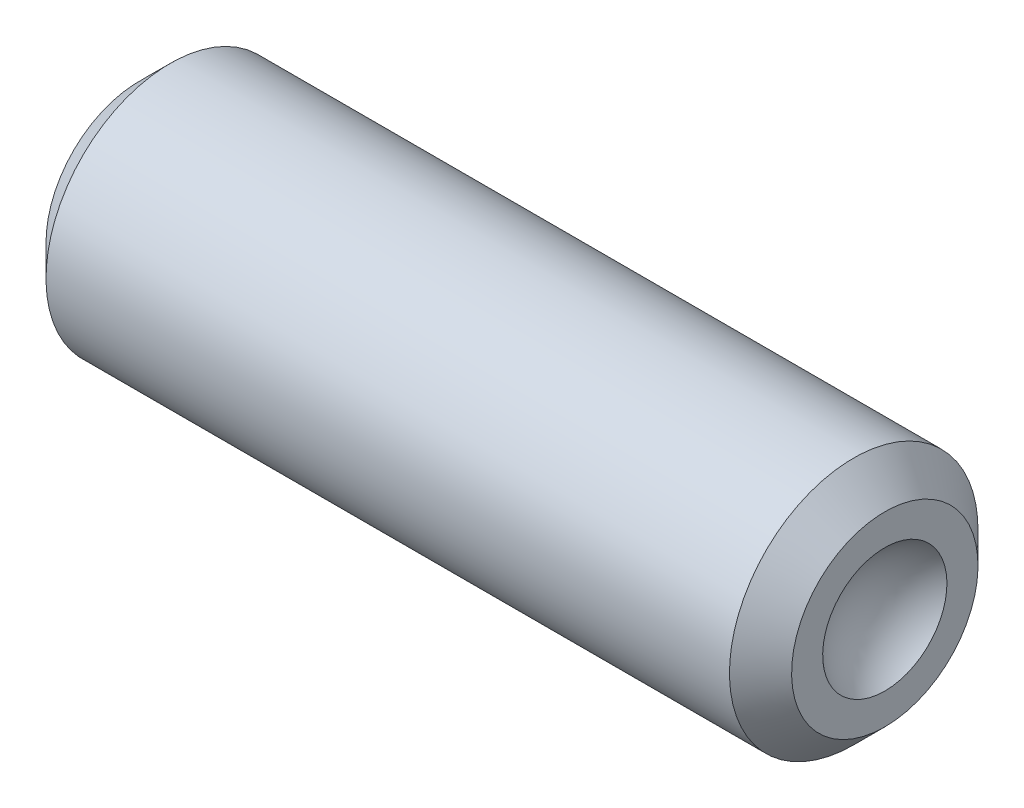
ISO-10303-21;
HEADER;
FILE_DESCRIPTION(('STEP AP214'),'2;1');
FILE_NAME('part.step','',(''),(''),'','','');
FILE_SCHEMA(('AUTOMOTIVE_DESIGN { 1 0 10303 214 1 1 1 1 }'));
ENDSEC;
DATA;
#1=APPLICATION_CONTEXT('core data for automotive mechanical design processes');
#2=APPLICATION_PROTOCOL_DEFINITION('international standard','automotive_design',2000,#1);
#3=PRODUCT_CONTEXT('',#1,'mechanical');
#4=PRODUCT('Part','Part','',(#3));
#5=PRODUCT_RELATED_PRODUCT_CATEGORY('part','',(#4));
#6=PRODUCT_DEFINITION_FORMATION('','',#4);
#7=PRODUCT_DEFINITION_CONTEXT('part definition',#1,'design');
#8=PRODUCT_DEFINITION('design','',#6,#7);
#9=PRODUCT_DEFINITION_SHAPE('','',#8);
#10=(LENGTH_UNIT() NAMED_UNIT(*) SI_UNIT(.MILLI.,.METRE.));
#11=(NAMED_UNIT(*) PLANE_ANGLE_UNIT() SI_UNIT($,.RADIAN.));
#12=(NAMED_UNIT(*) SI_UNIT($,.STERADIAN.) SOLID_ANGLE_UNIT());
#13=UNCERTAINTY_MEASURE_WITH_UNIT(LENGTH_MEASURE(1.E-05),#10,'distance_accuracy_value','');
#14=(GEOMETRIC_REPRESENTATION_CONTEXT(3) GLOBAL_UNCERTAINTY_ASSIGNED_CONTEXT((#13)) GLOBAL_UNIT_ASSIGNED_CONTEXT((#10,
#11,#12)) REPRESENTATION_CONTEXT('',''));
#15=CARTESIAN_POINT('',(0.,0.,0.));
#16=DIRECTION('',(0.,0.,1.));
#17=DIRECTION('',(1.,0.,0.));
#18=AXIS2_PLACEMENT_3D('',#15,#16,#17);
#19=CARTESIAN_POINT('',(0.,0.,0.));
#20=DIRECTION('',(1.,0.,0.));
#21=DIRECTION('',(0.,1.,0.));
#22=AXIS2_PLACEMENT_3D('',#19,#20,#21);
#23=PLANE('',#22);
#24=DIRECTION('',(0.,-0.5,-0.866025403784439));
#25=VECTOR('',#24,1.);
#26=CARTESIAN_POINT('',(0.,1.15470053837925,0.));
#27=LINE('',#26,#25);
#28=CARTESIAN_POINT('',(0.,1.15470053837925,0.));
#29=VERTEX_POINT('',#28);
#30=CARTESIAN_POINT('',(0.,0.577350269189626,-1.));
#31=VERTEX_POINT('',#30);
#32=EDGE_CURVE('E107',#29,#31,#27,.T.);
#33=ORIENTED_EDGE('',*,*,#32,.F.);
#34=DIRECTION('',(0.,0.5,-0.866025403784438));
#35=VECTOR('',#34,1.);
#36=CARTESIAN_POINT('',(0.,0.577350269189626,1.));
#37=LINE('',#36,#35);
#38=CARTESIAN_POINT('',(0.,0.577350269189626,1.));
#39=VERTEX_POINT('',#38);
#40=EDGE_CURVE('E49',#39,#29,#37,.T.);
#41=ORIENTED_EDGE('',*,*,#40,.F.);
#42=DIRECTION('',(0.,1.,0.));
#43=VECTOR('',#42,1.);
#44=CARTESIAN_POINT('',(0.,-0.577350269189626,1.));
#45=LINE('',#44,#43);
#46=CARTESIAN_POINT('',(0.,-0.577350269189626,1.));
#47=VERTEX_POINT('',#46);
#48=EDGE_CURVE('E122',#47,#39,#45,.T.);
#49=ORIENTED_EDGE('',*,*,#48,.F.);
#50=DIRECTION('',(0.,0.5,0.866025403784439));
#51=VECTOR('',#50,1.);
#52=CARTESIAN_POINT('',(0.,-1.15470053837925,0.));
#53=LINE('',#52,#51);
#54=CARTESIAN_POINT('',(0.,-1.15470053837925,0.));
#55=VERTEX_POINT('',#54);
#56=EDGE_CURVE('E116',#55,#47,#53,.T.);
#57=ORIENTED_EDGE('',*,*,#56,.F.);
#58=DIRECTION('',(0.,-0.5,0.866025403784438));
#59=VECTOR('',#58,1.);
#60=CARTESIAN_POINT('',(0.,-0.577350269189625,-1.));
#61=LINE('',#60,#59);
#62=CARTESIAN_POINT('',(0.,-0.577350269189625,-1.));
#63=VERTEX_POINT('',#62);
#64=EDGE_CURVE('E114',#63,#55,#61,.T.);
#65=ORIENTED_EDGE('',*,*,#64,.F.);
#66=DIRECTION('',(0.,-1.,0.));
#67=VECTOR('',#66,1.);
#68=CARTESIAN_POINT('',(0.,0.577350269189626,-1.));
#69=LINE('',#68,#67);
#70=EDGE_CURVE('E100',#31,#63,#69,.T.);
#71=ORIENTED_EDGE('',*,*,#70,.F.);
#72=EDGE_LOOP('',(#33,#41,#49,#57,#65,#71));
#73=FACE_BOUND('',#72,.T.);
#74=CARTESIAN_POINT('',(0.,0.,0.));
#75=DIRECTION('',(-1.,0.,0.));
#76=DIRECTION('',(0.,-1.,0.));
#77=AXIS2_PLACEMENT_3D('',#74,#75,#76);
#78=CIRCLE('',#77,1.5);
#79=CARTESIAN_POINT('',(0.,-1.5,0.));
#80=VERTEX_POINT('',#79);
#81=EDGE_CURVE('E12',#80,#80,#78,.T.);
#82=ORIENTED_EDGE('',*,*,#81,.T.);
#83=EDGE_LOOP('',(#82));
#84=FACE_BOUND('',#83,.T.);
#85=ADVANCED_FACE('F35',(#73,#84),#23,.F.);
#86=CARTESIAN_POINT('',(0.500000000000001,0.,0.));
#87=DIRECTION('',(1.,0.,0.));
#88=DIRECTION('',(0.,1.,0.));
#89=AXIS2_PLACEMENT_3D('',#86,#87,#88);
#90=CONICAL_SURFACE('',#89,2.,0.785398163397447);
#91=ORIENTED_EDGE('',*,*,#81,.F.);
#92=EDGE_LOOP('',(#91));
#93=FACE_BOUND('',#92,.T.);
#94=CARTESIAN_POINT('',(0.500000000000001,0.,0.));
#95=DIRECTION('',(-1.,0.,0.));
#96=DIRECTION('',(0.,-1.,0.));
#97=AXIS2_PLACEMENT_3D('',#94,#95,#96);
#98=CIRCLE('',#97,2.);
#99=CARTESIAN_POINT('',(0.500000000000001,-2.,0.));
#100=VERTEX_POINT('',#99);
#101=EDGE_CURVE('E42',#100,#100,#98,.T.);
#102=ORIENTED_EDGE('',*,*,#101,.T.);
#103=EDGE_LOOP('',(#102));
#104=FACE_BOUND('',#103,.T.);
#105=ADVANCED_FACE('F145',(#93,#104),#90,.T.);
#106=CARTESIAN_POINT('',(0.,0.,0.));
#107=DIRECTION('',(-1.,0.,0.));
#108=DIRECTION('',(0.,-1.,0.));
#109=AXIS2_PLACEMENT_3D('',#106,#107,#108);
#110=CYLINDRICAL_SURFACE('',#109,2.);
#111=ORIENTED_EDGE('',*,*,#101,.F.);
#112=EDGE_LOOP('',(#111));
#113=FACE_BOUND('',#112,.T.);
#114=CARTESIAN_POINT('',(11.5,0.,0.));
#115=DIRECTION('',(-1.,0.,0.));
#116=DIRECTION('',(0.,-1.,0.));
#117=AXIS2_PLACEMENT_3D('',#114,#115,#116);
#118=CIRCLE('',#117,2.);
#119=CARTESIAN_POINT('',(11.5,-2.,0.));
#120=VERTEX_POINT('',#119);
#121=EDGE_CURVE('E140',#120,#120,#118,.T.);
#122=ORIENTED_EDGE('',*,*,#121,.T.);
#123=EDGE_LOOP('',(#122));
#124=FACE_BOUND('',#123,.T.);
#125=ADVANCED_FACE('F147',(#113,#124),#110,.T.);
#126=CARTESIAN_POINT('',(12.,0.,0.));
#127=DIRECTION('',(-1.,0.,0.));
#128=DIRECTION('',(0.,-1.,0.));
#129=AXIS2_PLACEMENT_3D('',#126,#127,#128);
#130=CONICAL_SURFACE('',#129,1.5,0.785398163397447);
#131=ORIENTED_EDGE('',*,*,#121,.F.);
#132=EDGE_LOOP('',(#131));
#133=FACE_BOUND('',#132,.T.);
#134=CARTESIAN_POINT('',(12.,0.,0.));
#135=DIRECTION('',(-1.,0.,0.));
#136=DIRECTION('',(0.,-1.,0.));
#137=AXIS2_PLACEMENT_3D('',#134,#135,#136);
#138=CIRCLE('',#137,1.5);
#139=CARTESIAN_POINT('',(12.,-1.5,0.));
#140=VERTEX_POINT('',#139);
#141=EDGE_CURVE('E137',#140,#140,#138,.T.);
#142=ORIENTED_EDGE('',*,*,#141,.T.);
#143=EDGE_LOOP('',(#142));
#144=FACE_BOUND('',#143,.T.);
#145=ADVANCED_FACE('F150',(#133,#144),#130,.T.);
#146=CARTESIAN_POINT('',(12.,1.5,0.));
#147=DIRECTION('',(-1.,0.,0.));
#148=DIRECTION('',(0.,-1.,0.));
#149=AXIS2_PLACEMENT_3D('',#146,#147,#148);
#150=PLANE('',#149);
#151=ORIENTED_EDGE('',*,*,#141,.F.);
#152=EDGE_LOOP('',(#151));
#153=FACE_BOUND('',#152,.T.);
#154=CARTESIAN_POINT('',(12.,0.,0.));
#155=DIRECTION('',(-1.,0.,0.));
#156=DIRECTION('',(0.,-1.,0.));
#157=AXIS2_PLACEMENT_3D('',#154,#155,#156);
#158=CIRCLE('',#157,1.);
#159=CARTESIAN_POINT('',(12.,-1.,0.));
#160=VERTEX_POINT('',#159);
#161=EDGE_CURVE('E134',#160,#160,#158,.T.);
#162=ORIENTED_EDGE('',*,*,#161,.T.);
#163=EDGE_LOOP('',(#162));
#164=FACE_BOUND('',#163,.T.);
#165=ADVANCED_FACE('F156',(#153,#164),#150,.F.);
#166=CARTESIAN_POINT('',(12.75,0.,0.));
#167=DIRECTION('',(-1.,0.,0.));
#168=DIRECTION('',(0.,-1.,0.));
#169=AXIS2_PLACEMENT_3D('',#166,#167,#168);
#170=SPHERICAL_SURFACE('',#169,1.25);
#171=ORIENTED_EDGE('',*,*,#161,.F.);
#172=EDGE_LOOP('',(#171));
#173=FACE_BOUND('',#172,.T.);
#174=ADVANCED_FACE('F162',(#173),#170,.F.);
#175=CARTESIAN_POINT('',(15.0550504633039,0.577350269189626,1.));
#176=DIRECTION('',(0.,0.866025403784439,0.5));
#177=DIRECTION('',(0.,-0.5,0.866025403784439));
#178=AXIS2_PLACEMENT_3D('',#175,#176,#177);
#179=PLANE('',#178);
#180=DIRECTION('',(0.,-0.5,0.866025403784439));
#181=VECTOR('',#180,1.);
#182=CARTESIAN_POINT('',(10.,0.577350269189626,1.));
#183=LINE('',#182,#181);
#184=CARTESIAN_POINT('',(10.,1.15470053837925,0.));
#185=VERTEX_POINT('',#184);
#186=CARTESIAN_POINT('',(10.,0.577350269189626,1.));
#187=VERTEX_POINT('',#186);
#188=EDGE_CURVE('E68',#185,#187,#183,.T.);
#189=ORIENTED_EDGE('',*,*,#188,.T.);
#190=DIRECTION('',(-1.,0.,0.));
#191=VECTOR('',#190,1.);
#192=CARTESIAN_POINT('',(15.0550504633039,0.577350269189626,1.));
#193=LINE('',#192,#191);
#194=EDGE_CURVE('E125',#187,#39,#193,.T.);
#195=ORIENTED_EDGE('',*,*,#194,.T.);
#196=ORIENTED_EDGE('',*,*,#40,.T.);
#197=DIRECTION('',(-1.,0.,0.));
#198=VECTOR('',#197,1.);
#199=CARTESIAN_POINT('',(15.0550504633039,1.15470053837925,0.));
#200=LINE('',#199,#198);
#201=EDGE_CURVE('E104',#185,#29,#200,.T.);
#202=ORIENTED_EDGE('',*,*,#201,.F.);
#203=EDGE_LOOP('',(#189,#195,#196,#202));
#204=FACE_BOUND('',#203,.T.);
#205=ADVANCED_FACE('F167',(#204),#179,.F.);
#206=CARTESIAN_POINT('',(15.0550504633039,-0.577350269189626,1.));
#207=DIRECTION('',(0.,0.,1.));
#208=DIRECTION('',(1.,0.,0.));
#209=AXIS2_PLACEMENT_3D('',#206,#207,#208);
#210=PLANE('',#209);
#211=DIRECTION('',(0.,-1.,0.));
#212=VECTOR('',#211,1.);
#213=CARTESIAN_POINT('',(10.,-0.577350269189626,1.));
#214=LINE('',#213,#212);
#215=CARTESIAN_POINT('',(10.,-0.577350269189626,1.));
#216=VERTEX_POINT('',#215);
#217=EDGE_CURVE('E267',#187,#216,#214,.T.);
#218=ORIENTED_EDGE('',*,*,#217,.T.);
#219=DIRECTION('',(-1.,0.,0.));
#220=VECTOR('',#219,1.);
#221=CARTESIAN_POINT('',(15.0550504633039,-0.577350269189626,1.));
#222=LINE('',#221,#220);
#223=EDGE_CURVE('E127',#216,#47,#222,.T.);
#224=ORIENTED_EDGE('',*,*,#223,.T.);
#225=ORIENTED_EDGE('',*,*,#48,.T.);
#226=ORIENTED_EDGE('',*,*,#194,.F.);
#227=EDGE_LOOP('',(#218,#224,#225,#226));
#228=FACE_BOUND('',#227,.T.);
#229=ADVANCED_FACE('F172',(#228),#210,.F.);
#230=CARTESIAN_POINT('',(15.0550504633039,-1.15470053837925,0.));
#231=DIRECTION('',(0.,-0.866025403784439,0.5));
#232=DIRECTION('',(0.,-0.5,-0.866025403784439));
#233=AXIS2_PLACEMENT_3D('',#230,#231,#232);
#234=PLANE('',#233);
#235=DIRECTION('',(0.,-0.5,-0.866025403784439));
#236=VECTOR('',#235,1.);
#237=CARTESIAN_POINT('',(10.,-1.15470053837925,0.));
#238=LINE('',#237,#236);
#239=CARTESIAN_POINT('',(10.,-1.15470053837925,0.));
#240=VERTEX_POINT('',#239);
#241=EDGE_CURVE('E270',#216,#240,#238,.T.);
#242=ORIENTED_EDGE('',*,*,#241,.T.);
#243=DIRECTION('',(-1.,0.,0.));
#244=VECTOR('',#243,1.);
#245=CARTESIAN_POINT('',(15.0550504633039,-1.15470053837925,0.));
#246=LINE('',#245,#244);
#247=EDGE_CURVE('E129',#240,#55,#246,.T.);
#248=ORIENTED_EDGE('',*,*,#247,.T.);
#249=ORIENTED_EDGE('',*,*,#56,.T.);
#250=ORIENTED_EDGE('',*,*,#223,.F.);
#251=EDGE_LOOP('',(#242,#248,#249,#250));
#252=FACE_BOUND('',#251,.T.);
#253=ADVANCED_FACE('F217',(#252),#234,.F.);
#254=CARTESIAN_POINT('',(15.0550504633039,-0.577350269189626,-1.));
#255=DIRECTION('',(0.,-0.866025403784439,-0.5));
#256=DIRECTION('',(0.,0.5,-0.866025403784439));
#257=AXIS2_PLACEMENT_3D('',#254,#255,#256);
#258=PLANE('',#257);
#259=DIRECTION('',(0.,0.5,-0.866025403784439));
#260=VECTOR('',#259,1.);
#261=CARTESIAN_POINT('',(10.,-0.577350269189626,-1.));
#262=LINE('',#261,#260);
#263=CARTESIAN_POINT('',(10.,-0.577350269189626,-1.));
#264=VERTEX_POINT('',#263);
#265=EDGE_CURVE('E58',#240,#264,#262,.T.);
#266=ORIENTED_EDGE('',*,*,#265,.T.);
#267=DIRECTION('',(-1.,0.,0.));
#268=VECTOR('',#267,1.);
#269=CARTESIAN_POINT('',(15.0550504633039,-0.577350269189626,-1.));
#270=LINE('',#269,#268);
#271=EDGE_CURVE('E103',#264,#63,#270,.T.);
#272=ORIENTED_EDGE('',*,*,#271,.T.);
#273=ORIENTED_EDGE('',*,*,#64,.T.);
#274=ORIENTED_EDGE('',*,*,#247,.F.);
#275=EDGE_LOOP('',(#266,#272,#273,#274));
#276=FACE_BOUND('',#275,.T.);
#277=ADVANCED_FACE('F227',(#276),#258,.F.);
#278=CARTESIAN_POINT('',(15.0550504633039,0.577350269189626,-1.));
#279=DIRECTION('',(0.,0.,-1.));
#280=DIRECTION('',(-1.,0.,0.));
#281=AXIS2_PLACEMENT_3D('',#278,#279,#280);
#282=PLANE('',#281);
#283=DIRECTION('',(0.,1.,0.));
#284=VECTOR('',#283,1.);
#285=CARTESIAN_POINT('',(10.,0.577350269189626,-1.));
#286=LINE('',#285,#284);
#287=CARTESIAN_POINT('',(10.,0.577350269189626,-1.));
#288=VERTEX_POINT('',#287);
#289=EDGE_CURVE('E102',#264,#288,#286,.T.);
#290=ORIENTED_EDGE('',*,*,#289,.T.);
#291=DIRECTION('',(-1.,0.,0.));
#292=VECTOR('',#291,1.);
#293=CARTESIAN_POINT('',(15.0550504633039,0.577350269189626,-1.));
#294=LINE('',#293,#292);
#295=EDGE_CURVE('E95',#288,#31,#294,.T.);
#296=ORIENTED_EDGE('',*,*,#295,.T.);
#297=ORIENTED_EDGE('',*,*,#70,.T.);
#298=ORIENTED_EDGE('',*,*,#271,.F.);
#299=EDGE_LOOP('',(#290,#296,#297,#298));
#300=FACE_BOUND('',#299,.T.);
#301=ADVANCED_FACE('F97',(#300),#282,.F.);
#302=CARTESIAN_POINT('',(15.0550504633039,1.15470053837925,0.));
#303=DIRECTION('',(0.,0.866025403784439,-0.5));
#304=DIRECTION('',(0.,0.5,0.866025403784439));
#305=AXIS2_PLACEMENT_3D('',#302,#303,#304);
#306=PLANE('',#305);
#307=DIRECTION('',(0.,0.5,0.866025403784439));
#308=VECTOR('',#307,1.);
#309=CARTESIAN_POINT('',(10.,1.15470053837925,0.));
#310=LINE('',#309,#308);
#311=EDGE_CURVE('E77',#288,#185,#310,.T.);
#312=ORIENTED_EDGE('',*,*,#311,.T.);
#313=ORIENTED_EDGE('',*,*,#201,.T.);
#314=ORIENTED_EDGE('',*,*,#32,.T.);
#315=ORIENTED_EDGE('',*,*,#295,.F.);
#316=EDGE_LOOP('',(#312,#313,#314,#315));
#317=FACE_BOUND('',#316,.T.);
#318=ADVANCED_FACE('F108',(#317),#306,.F.);
#319=CARTESIAN_POINT('',(10.,1.5,0.));
#320=DIRECTION('',(-1.,0.,0.));
#321=DIRECTION('',(0.,-1.,0.));
#322=AXIS2_PLACEMENT_3D('',#319,#320,#321);
#323=PLANE('',#322);
#324=ORIENTED_EDGE('',*,*,#188,.F.);
#325=ORIENTED_EDGE('',*,*,#311,.F.);
#326=ORIENTED_EDGE('',*,*,#289,.F.);
#327=ORIENTED_EDGE('',*,*,#265,.F.);
#328=ORIENTED_EDGE('',*,*,#241,.F.);
#329=ORIENTED_EDGE('',*,*,#217,.F.);
#330=EDGE_LOOP('',(#324,#325,#326,#327,#328,#329));
#331=FACE_BOUND('',#330,.T.);
#332=ADVANCED_FACE('F253',(#331),#323,.T.);
#333=CLOSED_SHELL('',(#85,#105,#125,#145,#165,#174,#205,#229,#253,#277,#301,#318,#332));
#334=MANIFOLD_SOLID_BREP('B2',#333);
#335=ADVANCED_BREP_SHAPE_REPRESENTATION('',(#18,#334),#14);
#336=SHAPE_DEFINITION_REPRESENTATION(#9,#335);
ENDSEC;
END-ISO-10303-21;
